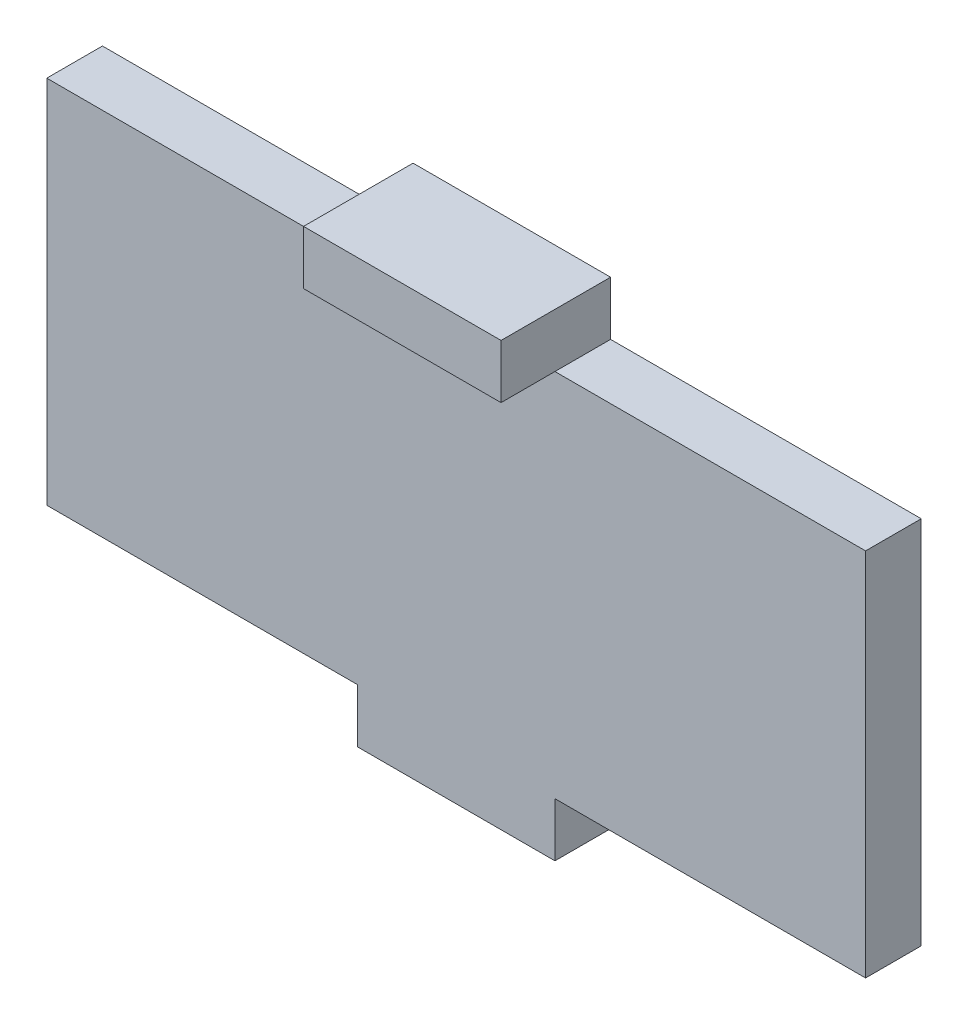
ISO-10303-21;
HEADER;
FILE_DESCRIPTION(('STEP AP214'),'2;1');
FILE_NAME('part.step','',(''),(''),'','','');
FILE_SCHEMA(('AUTOMOTIVE_DESIGN { 1 0 10303 214 1 1 1 1 }'));
ENDSEC;
DATA;
#1=APPLICATION_CONTEXT('core data for automotive mechanical design processes');
#2=APPLICATION_PROTOCOL_DEFINITION('international standard','automotive_design',2000,#1);
#3=PRODUCT_CONTEXT('',#1,'mechanical');
#4=PRODUCT('Part','Part','',(#3));
#5=PRODUCT_RELATED_PRODUCT_CATEGORY('part','',(#4));
#6=PRODUCT_DEFINITION_FORMATION('','',#4);
#7=PRODUCT_DEFINITION_CONTEXT('part definition',#1,'design');
#8=PRODUCT_DEFINITION('design','',#6,#7);
#9=PRODUCT_DEFINITION_SHAPE('','',#8);
#10=(LENGTH_UNIT() NAMED_UNIT(*) SI_UNIT(.MILLI.,.METRE.));
#11=(NAMED_UNIT(*) PLANE_ANGLE_UNIT() SI_UNIT($,.RADIAN.));
#12=(NAMED_UNIT(*) SI_UNIT($,.STERADIAN.) SOLID_ANGLE_UNIT());
#13=UNCERTAINTY_MEASURE_WITH_UNIT(LENGTH_MEASURE(1.E-05),#10,'distance_accuracy_value','');
#14=(GEOMETRIC_REPRESENTATION_CONTEXT(3) GLOBAL_UNCERTAINTY_ASSIGNED_CONTEXT((#13)) GLOBAL_UNIT_ASSIGNED_CONTEXT((#10,
#11,#12)) REPRESENTATION_CONTEXT('',''));
#15=CARTESIAN_POINT('',(0.,0.,0.));
#16=DIRECTION('',(0.,0.,1.));
#17=DIRECTION('',(1.,0.,0.));
#18=AXIS2_PLACEMENT_3D('',#15,#16,#17);
#19=CARTESIAN_POINT('',(0.,-3.,1.1));
#20=DIRECTION('',(0.,-1.,0.));
#21=DIRECTION('',(1.,0.,0.));
#22=AXIS2_PLACEMENT_3D('',#19,#20,#21);
#23=PLANE('',#22);
#24=DIRECTION('',(0.,0.,-1.));
#25=VECTOR('',#24,1.);
#26=CARTESIAN_POINT('',(17.3,-3.,1.1));
#27=LINE('',#26,#25);
#28=CARTESIAN_POINT('',(17.3,-3.,1.1));
#29=VERTEX_POINT('',#28);
#30=CARTESIAN_POINT('',(17.3,-3.,-1.99999999999867));
#31=VERTEX_POINT('',#30);
#32=EDGE_CURVE('E54',#29,#31,#27,.T.);
#33=ORIENTED_EDGE('',*,*,#32,.T.);
#34=DIRECTION('',(-1.,0.,0.));
#35=VECTOR('',#34,1.);
#36=CARTESIAN_POINT('',(0.,-3.,-2.));
#37=LINE('',#36,#35);
#38=CARTESIAN_POINT('',(28.3,-3.,-2.));
#39=VERTEX_POINT('',#38);
#40=EDGE_CURVE('E154',#39,#31,#37,.T.);
#41=ORIENTED_EDGE('',*,*,#40,.F.);
#42=DIRECTION('',(0.,0.,-1.));
#43=VECTOR('',#42,1.);
#44=CARTESIAN_POINT('',(28.3,-3.,1.1));
#45=LINE('',#44,#43);
#46=CARTESIAN_POINT('',(28.3,-3.,1.1));
#47=VERTEX_POINT('',#46);
#48=EDGE_CURVE('E11',#47,#39,#45,.T.);
#49=ORIENTED_EDGE('',*,*,#48,.F.);
#50=DIRECTION('',(-1.,0.,0.));
#51=VECTOR('',#50,1.);
#52=CARTESIAN_POINT('',(0.,-3.,1.1));
#53=LINE('',#52,#51);
#54=EDGE_CURVE('E226',#47,#29,#53,.T.);
#55=ORIENTED_EDGE('',*,*,#54,.T.);
#56=EDGE_LOOP('',(#33,#41,#49,#55));
#57=FACE_BOUND('',#56,.T.);
#58=ADVANCED_FACE('F39',(#57),#23,.T.);
#59=CARTESIAN_POINT('',(28.3,0.,1.1));
#60=DIRECTION('',(-1.,0.,0.));
#61=DIRECTION('',(0.,0.,1.));
#62=AXIS2_PLACEMENT_3D('',#59,#60,#61);
#63=PLANE('',#62);
#64=ORIENTED_EDGE('',*,*,#48,.T.);
#65=DIRECTION('',(0.,-1.,0.));
#66=VECTOR('',#65,1.);
#67=CARTESIAN_POINT('',(28.3,0.,-2.));
#68=LINE('',#67,#66);
#69=CARTESIAN_POINT('',(28.3,0.,-2.));
#70=VERTEX_POINT('',#69);
#71=EDGE_CURVE('E148',#70,#39,#68,.T.);
#72=ORIENTED_EDGE('',*,*,#71,.F.);
#73=DIRECTION('',(0.,0.,-1.));
#74=VECTOR('',#73,1.);
#75=CARTESIAN_POINT('',(28.3,0.,1.1));
#76=LINE('',#75,#74);
#77=CARTESIAN_POINT('',(28.3,0.,1.1));
#78=VERTEX_POINT('',#77);
#79=EDGE_CURVE('E47',#78,#70,#76,.T.);
#80=ORIENTED_EDGE('',*,*,#79,.F.);
#81=DIRECTION('',(0.,1.,0.));
#82=VECTOR('',#81,1.);
#83=CARTESIAN_POINT('',(28.3,0.,1.1));
#84=LINE('',#83,#82);
#85=EDGE_CURVE('E229',#47,#78,#84,.T.);
#86=ORIENTED_EDGE('',*,*,#85,.F.);
#87=EDGE_LOOP('',(#64,#72,#80,#86));
#88=FACE_BOUND('',#87,.T.);
#89=ADVANCED_FACE('F149',(#88),#63,.F.);
#90=CARTESIAN_POINT('',(0.,0.,1.1));
#91=DIRECTION('',(0.,1.,0.));
#92=DIRECTION('',(0.,0.,1.));
#93=AXIS2_PLACEMENT_3D('',#90,#91,#92);
#94=PLANE('',#93);
#95=ORIENTED_EDGE('',*,*,#79,.T.);
#96=DIRECTION('',(-1.,0.,0.));
#97=VECTOR('',#96,1.);
#98=CARTESIAN_POINT('',(0.,0.,-2.));
#99=LINE('',#98,#97);
#100=CARTESIAN_POINT('',(45.6000000000016,0.,-1.9999999999992));
#101=VERTEX_POINT('',#100);
#102=EDGE_CURVE('E141',#101,#70,#99,.T.);
#103=ORIENTED_EDGE('',*,*,#102,.F.);
#104=DIRECTION('',(0.,0.,-1.));
#105=VECTOR('',#104,1.);
#106=CARTESIAN_POINT('',(45.6,0.,1.1));
#107=LINE('',#106,#105);
#108=CARTESIAN_POINT('',(45.6,0.,1.1));
#109=VERTEX_POINT('',#108);
#110=EDGE_CURVE('E146',#109,#101,#107,.T.);
#111=ORIENTED_EDGE('',*,*,#110,.F.);
#112=DIRECTION('',(1.,0.,0.));
#113=VECTOR('',#112,1.);
#114=CARTESIAN_POINT('',(0.,0.,1.1));
#115=LINE('',#114,#113);
#116=EDGE_CURVE('E142',#78,#109,#115,.T.);
#117=ORIENTED_EDGE('',*,*,#116,.F.);
#118=EDGE_LOOP('',(#95,#103,#111,#117));
#119=FACE_BOUND('',#118,.T.);
#120=ADVANCED_FACE('F138',(#119),#94,.F.);
#121=CARTESIAN_POINT('',(45.6,0.,1.1));
#122=DIRECTION('',(-1.,0.,0.));
#123=DIRECTION('',(0.,0.,1.));
#124=AXIS2_PLACEMENT_3D('',#121,#122,#123);
#125=PLANE('',#124);
#126=ORIENTED_EDGE('',*,*,#110,.T.);
#127=DIRECTION('',(0.,-1.,0.));
#128=VECTOR('',#127,1.);
#129=CARTESIAN_POINT('',(45.6000000000016,0.,-1.9999999999992));
#130=LINE('',#129,#128);
#131=CARTESIAN_POINT('',(45.6,20.6000000000008,-1.9999999999992));
#132=VERTEX_POINT('',#131);
#133=EDGE_CURVE('E160',#132,#101,#130,.T.);
#134=ORIENTED_EDGE('',*,*,#133,.F.);
#135=DIRECTION('',(0.,0.,-1.));
#136=VECTOR('',#135,1.);
#137=CARTESIAN_POINT('',(45.6,20.6,1.1));
#138=LINE('',#137,#136);
#139=CARTESIAN_POINT('',(45.6,20.6,1.1));
#140=VERTEX_POINT('',#139);
#141=EDGE_CURVE('E277',#140,#132,#138,.T.);
#142=ORIENTED_EDGE('',*,*,#141,.F.);
#143=DIRECTION('',(0.,1.,0.));
#144=VECTOR('',#143,1.);
#145=CARTESIAN_POINT('',(45.6,0.,1.1));
#146=LINE('',#145,#144);
#147=EDGE_CURVE('E234',#109,#140,#146,.T.);
#148=ORIENTED_EDGE('',*,*,#147,.F.);
#149=EDGE_LOOP('',(#126,#134,#142,#148));
#150=FACE_BOUND('',#149,.T.);
#151=ADVANCED_FACE('F283',(#150),#125,.F.);
#152=CARTESIAN_POINT('',(0.,20.6,1.1));
#153=DIRECTION('',(0.,1.,0.));
#154=DIRECTION('',(0.,0.,1.));
#155=AXIS2_PLACEMENT_3D('',#152,#153,#154);
#156=PLANE('',#155);
#157=ORIENTED_EDGE('',*,*,#141,.T.);
#158=DIRECTION('',(1.,0.,0.));
#159=VECTOR('',#158,1.);
#160=CARTESIAN_POINT('',(1.00613961606655E-13,20.6000000000008,-2.));
#161=LINE('',#160,#159);
#162=CARTESIAN_POINT('',(28.3,20.6000000000009,-2.));
#163=VERTEX_POINT('',#162);
#164=EDGE_CURVE('E194',#163,#132,#161,.T.);
#165=ORIENTED_EDGE('',*,*,#164,.F.);
#166=DIRECTION('',(0.,0.,-1.));
#167=VECTOR('',#166,1.);
#168=CARTESIAN_POINT('',(28.3,20.6,1.1));
#169=LINE('',#168,#167);
#170=CARTESIAN_POINT('',(28.3,20.6,1.1));
#171=VERTEX_POINT('',#170);
#172=EDGE_CURVE('E274',#171,#163,#169,.T.);
#173=ORIENTED_EDGE('',*,*,#172,.F.);
#174=DIRECTION('',(1.,0.,0.));
#175=VECTOR('',#174,1.);
#176=CARTESIAN_POINT('',(0.,20.6,1.1));
#177=LINE('',#176,#175);
#178=EDGE_CURVE('E237',#171,#140,#177,.T.);
#179=ORIENTED_EDGE('',*,*,#178,.T.);
#180=EDGE_LOOP('',(#157,#165,#173,#179));
#181=FACE_BOUND('',#180,.T.);
#182=ADVANCED_FACE('F321',(#181),#156,.T.);
#183=CARTESIAN_POINT('',(28.3,0.,1.1));
#184=DIRECTION('',(-1.,0.,0.));
#185=DIRECTION('',(0.,0.,1.));
#186=AXIS2_PLACEMENT_3D('',#183,#184,#185);
#187=PLANE('',#186);
#188=ORIENTED_EDGE('',*,*,#172,.T.);
#189=DIRECTION('',(0.,-1.,0.));
#190=VECTOR('',#189,1.);
#191=CARTESIAN_POINT('',(28.3,0.,-2.));
#192=LINE('',#191,#190);
#193=CARTESIAN_POINT('',(28.3,23.6,-2.));
#194=VERTEX_POINT('',#193);
#195=EDGE_CURVE('E190',#194,#163,#192,.T.);
#196=ORIENTED_EDGE('',*,*,#195,.F.);
#197=DIRECTION('',(0.,0.,-1.));
#198=VECTOR('',#197,1.);
#199=CARTESIAN_POINT('',(28.3,23.6,1.1));
#200=LINE('',#199,#198);
#201=CARTESIAN_POINT('',(28.3,23.6,4.1));
#202=VERTEX_POINT('',#201);
#203=EDGE_CURVE('E271',#202,#194,#200,.T.);
#204=ORIENTED_EDGE('',*,*,#203,.F.);
#205=DIRECTION('',(0.,1.,0.));
#206=VECTOR('',#205,1.);
#207=CARTESIAN_POINT('',(28.3,23.6,4.1));
#208=LINE('',#207,#206);
#209=CARTESIAN_POINT('',(28.3,20.6,4.1));
#210=VERTEX_POINT('',#209);
#211=EDGE_CURVE('E207',#210,#202,#208,.T.);
#212=ORIENTED_EDGE('',*,*,#211,.F.);
#213=DIRECTION('',(0.,0.,-1.));
#214=VECTOR('',#213,1.);
#215=CARTESIAN_POINT('',(28.3,20.6,4.1));
#216=LINE('',#215,#214);
#217=EDGE_CURVE('E215',#210,#171,#216,.T.);
#218=ORIENTED_EDGE('',*,*,#217,.T.);
#219=EDGE_LOOP('',(#188,#196,#204,#212,#218));
#220=FACE_BOUND('',#219,.T.);
#221=ADVANCED_FACE('F315',(#220),#187,.F.);
#222=CARTESIAN_POINT('',(0.,23.6,1.1));
#223=DIRECTION('',(0.,1.,0.));
#224=DIRECTION('',(0.,0.,1.));
#225=AXIS2_PLACEMENT_3D('',#222,#223,#224);
#226=PLANE('',#225);
#227=ORIENTED_EDGE('',*,*,#203,.T.);
#228=DIRECTION('',(1.,0.,0.));
#229=VECTOR('',#228,1.);
#230=CARTESIAN_POINT('',(0.,23.600000000001,-2.));
#231=LINE('',#230,#229);
#232=CARTESIAN_POINT('',(17.3,23.600000000001,-1.99999999999898));
#233=VERTEX_POINT('',#232);
#234=EDGE_CURVE('E186',#233,#194,#231,.T.);
#235=ORIENTED_EDGE('',*,*,#234,.F.);
#236=DIRECTION('',(0.,0.,-1.));
#237=VECTOR('',#236,1.);
#238=CARTESIAN_POINT('',(17.3,23.6,1.1));
#239=LINE('',#238,#237);
#240=CARTESIAN_POINT('',(17.3,23.6,4.1));
#241=VERTEX_POINT('',#240);
#242=EDGE_CURVE('E268',#241,#233,#239,.T.);
#243=ORIENTED_EDGE('',*,*,#242,.F.);
#244=DIRECTION('',(-1.,0.,0.));
#245=VECTOR('',#244,1.);
#246=CARTESIAN_POINT('',(17.3,23.6,4.1));
#247=LINE('',#246,#245);
#248=EDGE_CURVE('E211',#202,#241,#247,.T.);
#249=ORIENTED_EDGE('',*,*,#248,.F.);
#250=EDGE_LOOP('',(#227,#235,#243,#249));
#251=FACE_BOUND('',#250,.T.);
#252=ADVANCED_FACE('F311',(#251),#226,.T.);
#253=CARTESIAN_POINT('',(17.3,0.,1.1));
#254=DIRECTION('',(-1.,0.,0.));
#255=DIRECTION('',(0.,0.,1.));
#256=AXIS2_PLACEMENT_3D('',#253,#254,#255);
#257=PLANE('',#256);
#258=ORIENTED_EDGE('',*,*,#242,.T.);
#259=DIRECTION('',(0.,1.,0.));
#260=VECTOR('',#259,1.);
#261=CARTESIAN_POINT('',(17.3,0.,-1.99999999999898));
#262=LINE('',#261,#260);
#263=CARTESIAN_POINT('',(17.3,20.6000000000009,-1.99999999999911));
#264=VERTEX_POINT('',#263);
#265=EDGE_CURVE('E182',#264,#233,#262,.T.);
#266=ORIENTED_EDGE('',*,*,#265,.F.);
#267=DIRECTION('',(0.,0.,-1.));
#268=VECTOR('',#267,1.);
#269=CARTESIAN_POINT('',(17.3,20.6,1.1));
#270=LINE('',#269,#268);
#271=CARTESIAN_POINT('',(17.3,20.6,1.1));
#272=VERTEX_POINT('',#271);
#273=EDGE_CURVE('E265',#272,#264,#270,.T.);
#274=ORIENTED_EDGE('',*,*,#273,.F.);
#275=DIRECTION('',(0.,0.,-1.));
#276=VECTOR('',#275,1.);
#277=CARTESIAN_POINT('',(17.3,20.6,4.1));
#278=LINE('',#277,#276);
#279=CARTESIAN_POINT('',(17.3,20.6,4.1));
#280=VERTEX_POINT('',#279);
#281=EDGE_CURVE('E222',#280,#272,#278,.T.);
#282=ORIENTED_EDGE('',*,*,#281,.F.);
#283=DIRECTION('',(0.,-1.,0.));
#284=VECTOR('',#283,1.);
#285=CARTESIAN_POINT('',(17.3,23.6,4.1));
#286=LINE('',#285,#284);
#287=EDGE_CURVE('E200',#241,#280,#286,.T.);
#288=ORIENTED_EDGE('',*,*,#287,.F.);
#289=EDGE_LOOP('',(#258,#266,#274,#282,#288));
#290=FACE_BOUND('',#289,.T.);
#291=ADVANCED_FACE('F306',(#290),#257,.T.);
#292=CARTESIAN_POINT('',(0.,20.6,1.1));
#293=DIRECTION('',(0.,1.,0.));
#294=DIRECTION('',(0.,0.,1.));
#295=AXIS2_PLACEMENT_3D('',#292,#293,#294);
#296=PLANE('',#295);
#297=ORIENTED_EDGE('',*,*,#273,.T.);
#298=DIRECTION('',(1.,0.,0.));
#299=VECTOR('',#298,1.);
#300=CARTESIAN_POINT('',(0.,20.6000000000007,-2.));
#301=LINE('',#300,#299);
#302=CARTESIAN_POINT('',(0.,20.6000000000007,-2.));
#303=VERTEX_POINT('',#302);
#304=EDGE_CURVE('E178',#303,#264,#301,.T.);
#305=ORIENTED_EDGE('',*,*,#304,.F.);
#306=DIRECTION('',(0.,0.,-1.));
#307=VECTOR('',#306,1.);
#308=CARTESIAN_POINT('',(0.,20.6,1.1));
#309=LINE('',#308,#307);
#310=CARTESIAN_POINT('',(0.,20.6,1.1));
#311=VERTEX_POINT('',#310);
#312=EDGE_CURVE('E262',#311,#303,#309,.T.);
#313=ORIENTED_EDGE('',*,*,#312,.F.);
#314=DIRECTION('',(1.,0.,0.));
#315=VECTOR('',#314,1.);
#316=CARTESIAN_POINT('',(0.,20.6,1.1));
#317=LINE('',#316,#315);
#318=EDGE_CURVE('E241',#311,#272,#317,.T.);
#319=ORIENTED_EDGE('',*,*,#318,.T.);
#320=EDGE_LOOP('',(#297,#305,#313,#319));
#321=FACE_BOUND('',#320,.T.);
#322=ADVANCED_FACE('F299',(#321),#296,.T.);
#323=CARTESIAN_POINT('',(0.,0.,1.1));
#324=DIRECTION('',(-1.,0.,0.));
#325=DIRECTION('',(0.,0.,1.));
#326=AXIS2_PLACEMENT_3D('',#323,#324,#325);
#327=PLANE('',#326);
#328=ORIENTED_EDGE('',*,*,#312,.T.);
#329=DIRECTION('',(0.,1.,0.));
#330=VECTOR('',#329,1.);
#331=CARTESIAN_POINT('',(0.,0.,-2.));
#332=LINE('',#331,#330);
#333=CARTESIAN_POINT('',(0.,0.,-2.));
#334=VERTEX_POINT('',#333);
#335=EDGE_CURVE('E174',#334,#303,#332,.T.);
#336=ORIENTED_EDGE('',*,*,#335,.F.);
#337=DIRECTION('',(0.,0.,-1.));
#338=VECTOR('',#337,1.);
#339=CARTESIAN_POINT('',(0.,0.,1.1));
#340=LINE('',#339,#338);
#341=CARTESIAN_POINT('',(0.,0.,1.1));
#342=VERTEX_POINT('',#341);
#343=EDGE_CURVE('E259',#342,#334,#340,.T.);
#344=ORIENTED_EDGE('',*,*,#343,.F.);
#345=DIRECTION('',(0.,1.,0.));
#346=VECTOR('',#345,1.);
#347=CARTESIAN_POINT('',(0.,0.,1.1));
#348=LINE('',#347,#346);
#349=EDGE_CURVE('E245',#342,#311,#348,.T.);
#350=ORIENTED_EDGE('',*,*,#349,.T.);
#351=EDGE_LOOP('',(#328,#336,#344,#350));
#352=FACE_BOUND('',#351,.T.);
#353=ADVANCED_FACE('F296',(#352),#327,.T.);
#354=CARTESIAN_POINT('',(0.,0.,1.1));
#355=DIRECTION('',(0.,1.,0.));
#356=DIRECTION('',(0.,0.,1.));
#357=AXIS2_PLACEMENT_3D('',#354,#355,#356);
#358=PLANE('',#357);
#359=ORIENTED_EDGE('',*,*,#343,.T.);
#360=DIRECTION('',(-1.,0.,0.));
#361=VECTOR('',#360,1.);
#362=CARTESIAN_POINT('',(0.,0.,-2.));
#363=LINE('',#362,#361);
#364=CARTESIAN_POINT('',(17.3,0.,-1.99999999999896));
#365=VERTEX_POINT('',#364);
#366=EDGE_CURVE('E170',#365,#334,#363,.T.);
#367=ORIENTED_EDGE('',*,*,#366,.F.);
#368=DIRECTION('',(0.,0.,-1.));
#369=VECTOR('',#368,1.);
#370=CARTESIAN_POINT('',(17.3,0.,1.1));
#371=LINE('',#370,#369);
#372=CARTESIAN_POINT('',(17.3,0.,1.1));
#373=VERTEX_POINT('',#372);
#374=EDGE_CURVE('E256',#373,#365,#371,.T.);
#375=ORIENTED_EDGE('',*,*,#374,.F.);
#376=DIRECTION('',(1.,0.,0.));
#377=VECTOR('',#376,1.);
#378=CARTESIAN_POINT('',(0.,0.,1.1));
#379=LINE('',#378,#377);
#380=EDGE_CURVE('E62',#342,#373,#379,.T.);
#381=ORIENTED_EDGE('',*,*,#380,.F.);
#382=EDGE_LOOP('',(#359,#367,#375,#381));
#383=FACE_BOUND('',#382,.T.);
#384=ADVANCED_FACE('F292',(#383),#358,.F.);
#385=CARTESIAN_POINT('',(17.3,0.,1.1));
#386=DIRECTION('',(-1.,0.,0.));
#387=DIRECTION('',(0.,0.,1.));
#388=AXIS2_PLACEMENT_3D('',#385,#386,#387);
#389=PLANE('',#388);
#390=ORIENTED_EDGE('',*,*,#374,.T.);
#391=DIRECTION('',(0.,1.,0.));
#392=VECTOR('',#391,1.);
#393=CARTESIAN_POINT('',(17.3,0.,-1.99999999999867));
#394=LINE('',#393,#392);
#395=EDGE_CURVE('E166',#31,#365,#394,.T.);
#396=ORIENTED_EDGE('',*,*,#395,.F.);
#397=ORIENTED_EDGE('',*,*,#32,.F.);
#398=DIRECTION('',(0.,1.,0.));
#399=VECTOR('',#398,1.);
#400=CARTESIAN_POINT('',(17.3,0.,1.1));
#401=LINE('',#400,#399);
#402=EDGE_CURVE('E251',#29,#373,#401,.T.);
#403=ORIENTED_EDGE('',*,*,#402,.T.);
#404=EDGE_LOOP('',(#390,#396,#397,#403));
#405=FACE_BOUND('',#404,.T.);
#406=ADVANCED_FACE('F290',(#405),#389,.T.);
#407=CARTESIAN_POINT('',(0.,0.,1.1));
#408=DIRECTION('',(0.,0.,1.));
#409=DIRECTION('',(1.,0.,0.));
#410=AXIS2_PLACEMENT_3D('',#407,#408,#409);
#411=PLANE('',#410);
#412=DIRECTION('',(1.,0.,0.));
#413=VECTOR('',#412,1.);
#414=CARTESIAN_POINT('',(17.3,20.6,1.1));
#415=LINE('',#414,#413);
#416=EDGE_CURVE('E199',#272,#171,#415,.T.);
#417=ORIENTED_EDGE('',*,*,#416,.F.);
#418=ORIENTED_EDGE('',*,*,#318,.F.);
#419=ORIENTED_EDGE('',*,*,#349,.F.);
#420=ORIENTED_EDGE('',*,*,#380,.T.);
#421=ORIENTED_EDGE('',*,*,#402,.F.);
#422=ORIENTED_EDGE('',*,*,#54,.F.);
#423=ORIENTED_EDGE('',*,*,#85,.T.);
#424=ORIENTED_EDGE('',*,*,#116,.T.);
#425=ORIENTED_EDGE('',*,*,#147,.T.);
#426=ORIENTED_EDGE('',*,*,#178,.F.);
#427=EDGE_LOOP('',(#417,#418,#419,#420,#421,#422,#423,#424,#425,#426));
#428=FACE_BOUND('',#427,.T.);
#429=ADVANCED_FACE('F285',(#428),#411,.T.);
#430=CARTESIAN_POINT('',(17.3,20.6,4.1));
#431=DIRECTION('',(0.,1.,0.));
#432=DIRECTION('',(0.,0.,1.));
#433=AXIS2_PLACEMENT_3D('',#430,#431,#432);
#434=PLANE('',#433);
#435=ORIENTED_EDGE('',*,*,#416,.T.);
#436=ORIENTED_EDGE('',*,*,#217,.F.);
#437=DIRECTION('',(1.,0.,0.));
#438=VECTOR('',#437,1.);
#439=CARTESIAN_POINT('',(17.3,20.6,4.1));
#440=LINE('',#439,#438);
#441=EDGE_CURVE('E204',#280,#210,#440,.T.);
#442=ORIENTED_EDGE('',*,*,#441,.F.);
#443=ORIENTED_EDGE('',*,*,#281,.T.);
#444=EDGE_LOOP('',(#435,#436,#442,#443));
#445=FACE_BOUND('',#444,.T.);
#446=ADVANCED_FACE('F318',(#445),#434,.F.);
#447=CARTESIAN_POINT('',(0.,0.,4.1));
#448=DIRECTION('',(0.,0.,1.));
#449=DIRECTION('',(1.,0.,0.));
#450=AXIS2_PLACEMENT_3D('',#447,#448,#449);
#451=PLANE('',#450);
#452=ORIENTED_EDGE('',*,*,#287,.T.);
#453=ORIENTED_EDGE('',*,*,#441,.T.);
#454=ORIENTED_EDGE('',*,*,#211,.T.);
#455=ORIENTED_EDGE('',*,*,#248,.T.);
#456=EDGE_LOOP('',(#452,#453,#454,#455));
#457=FACE_BOUND('',#456,.T.);
#458=ADVANCED_FACE('F317',(#457),#451,.T.);
#459=CARTESIAN_POINT('',(0.,0.,-2.));
#460=DIRECTION('',(0.,0.,-1.));
#461=DIRECTION('',(-1.,0.,0.));
#462=AXIS2_PLACEMENT_3D('',#459,#460,#461);
#463=PLANE('',#462);
#464=ORIENTED_EDGE('',*,*,#102,.T.);
#465=ORIENTED_EDGE('',*,*,#71,.T.);
#466=ORIENTED_EDGE('',*,*,#40,.T.);
#467=ORIENTED_EDGE('',*,*,#395,.T.);
#468=ORIENTED_EDGE('',*,*,#366,.T.);
#469=ORIENTED_EDGE('',*,*,#335,.T.);
#470=ORIENTED_EDGE('',*,*,#304,.T.);
#471=ORIENTED_EDGE('',*,*,#265,.T.);
#472=ORIENTED_EDGE('',*,*,#234,.T.);
#473=ORIENTED_EDGE('',*,*,#195,.T.);
#474=ORIENTED_EDGE('',*,*,#164,.T.);
#475=ORIENTED_EDGE('',*,*,#133,.T.);
#476=EDGE_LOOP('',(#464,#465,#466,#467,#468,#469,#470,#471,#472,#473,#474,#475));
#477=FACE_BOUND('',#476,.T.);
#478=ADVANCED_FACE('F157',(#477),#463,.T.);
#479=CLOSED_SHELL('',(#58,#89,#120,#151,#182,#221,#252,#291,#322,#353,#384,#406,#429,#446,#458,#478));
#480=MANIFOLD_SOLID_BREP('B2',#479);
#481=ADVANCED_BREP_SHAPE_REPRESENTATION('',(#18,#480),#14);
#482=SHAPE_DEFINITION_REPRESENTATION(#9,#481);
ENDSEC;
END-ISO-10303-21;
